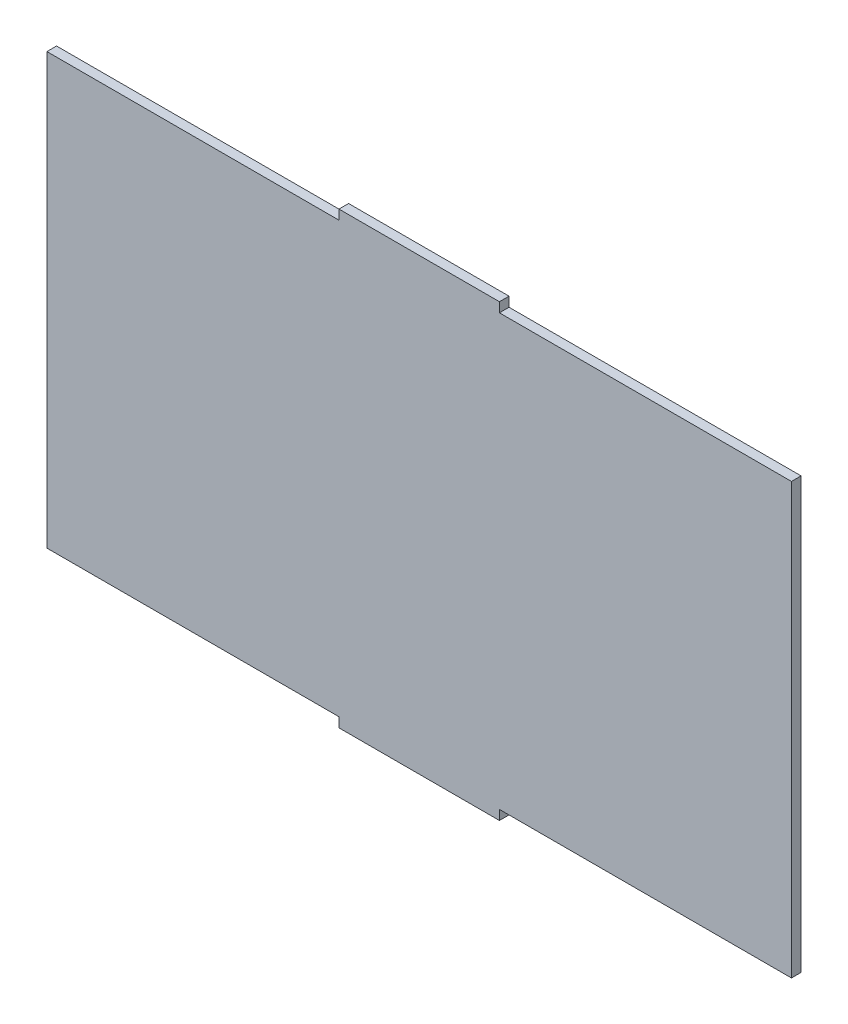
ISO-10303-21;
HEADER;
FILE_DESCRIPTION(('STEP AP214'),'2;1');
FILE_NAME('part.step','',(''),(''),'','','');
FILE_SCHEMA(('AUTOMOTIVE_DESIGN { 1 0 10303 214 1 1 1 1 }'));
ENDSEC;
DATA;
#1=APPLICATION_CONTEXT('core data for automotive mechanical design processes');
#2=APPLICATION_PROTOCOL_DEFINITION('international standard','automotive_design',2000,#1);
#3=PRODUCT_CONTEXT('',#1,'mechanical');
#4=PRODUCT('Part','Part','',(#3));
#5=PRODUCT_RELATED_PRODUCT_CATEGORY('part','',(#4));
#6=PRODUCT_DEFINITION_FORMATION('','',#4);
#7=PRODUCT_DEFINITION_CONTEXT('part definition',#1,'design');
#8=PRODUCT_DEFINITION('design','',#6,#7);
#9=PRODUCT_DEFINITION_SHAPE('','',#8);
#10=(LENGTH_UNIT() NAMED_UNIT(*) SI_UNIT(.MILLI.,.METRE.));
#11=(NAMED_UNIT(*) PLANE_ANGLE_UNIT() SI_UNIT($,.RADIAN.));
#12=(NAMED_UNIT(*) SI_UNIT($,.STERADIAN.) SOLID_ANGLE_UNIT());
#13=UNCERTAINTY_MEASURE_WITH_UNIT(LENGTH_MEASURE(1.E-05),#10,'distance_accuracy_value','');
#14=(GEOMETRIC_REPRESENTATION_CONTEXT(3) GLOBAL_UNCERTAINTY_ASSIGNED_CONTEXT((#13)) GLOBAL_UNIT_ASSIGNED_CONTEXT((#10,
#11,#12)) REPRESENTATION_CONTEXT('',''));
#15=CARTESIAN_POINT('',(0.,0.,0.));
#16=DIRECTION('',(0.,0.,1.));
#17=DIRECTION('',(1.,0.,0.));
#18=AXIS2_PLACEMENT_3D('',#15,#16,#17);
#19=CARTESIAN_POINT('',(0.,134.,3.));
#20=DIRECTION('',(1.,0.,0.));
#21=DIRECTION('',(0.,0.,-1.));
#22=AXIS2_PLACEMENT_3D('',#19,#20,#21);
#23=PLANE('',#22);
#24=DIRECTION('',(0.,-1.,0.));
#25=VECTOR('',#24,1.);
#26=CARTESIAN_POINT('',(0.,134.,0.));
#27=LINE('',#26,#25);
#28=CARTESIAN_POINT('',(0.,134.,0.));
#29=VERTEX_POINT('',#28);
#30=CARTESIAN_POINT('',(0.,0.,0.));
#31=VERTEX_POINT('',#30);
#32=EDGE_CURVE('E153',#29,#31,#27,.T.);
#33=ORIENTED_EDGE('',*,*,#32,.T.);
#34=DIRECTION('',(0.,0.,-1.));
#35=VECTOR('',#34,1.);
#36=CARTESIAN_POINT('',(0.,0.,3.));
#37=LINE('',#36,#35);
#38=CARTESIAN_POINT('',(0.,0.,3.));
#39=VERTEX_POINT('',#38);
#40=EDGE_CURVE('E11',#39,#31,#37,.T.);
#41=ORIENTED_EDGE('',*,*,#40,.F.);
#42=DIRECTION('',(0.,-1.,0.));
#43=VECTOR('',#42,1.);
#44=CARTESIAN_POINT('',(0.,134.,3.));
#45=LINE('',#44,#43);
#46=CARTESIAN_POINT('',(0.,134.,3.));
#47=VERTEX_POINT('',#46);
#48=EDGE_CURVE('E175',#47,#39,#45,.T.);
#49=ORIENTED_EDGE('',*,*,#48,.F.);
#50=DIRECTION('',(0.,0.,-1.));
#51=VECTOR('',#50,1.);
#52=CARTESIAN_POINT('',(0.,134.,3.));
#53=LINE('',#52,#51);
#54=EDGE_CURVE('E149',#47,#29,#53,.T.);
#55=ORIENTED_EDGE('',*,*,#54,.T.);
#56=EDGE_LOOP('',(#33,#41,#49,#55));
#57=FACE_BOUND('',#56,.T.);
#58=ADVANCED_FACE('F33',(#57),#23,.F.);
#59=CARTESIAN_POINT('',(0.,0.,3.));
#60=DIRECTION('',(0.,1.,0.));
#61=DIRECTION('',(0.,0.,1.));
#62=AXIS2_PLACEMENT_3D('',#59,#60,#61);
#63=PLANE('',#62);
#64=DIRECTION('',(1.,0.,0.));
#65=VECTOR('',#64,1.);
#66=CARTESIAN_POINT('',(0.,0.,0.));
#67=LINE('',#66,#65);
#68=CARTESIAN_POINT('',(91.,0.,0.));
#69=VERTEX_POINT('',#68);
#70=EDGE_CURVE('E156',#31,#69,#67,.T.);
#71=ORIENTED_EDGE('',*,*,#70,.T.);
#72=DIRECTION('',(0.,0.,-1.));
#73=VECTOR('',#72,1.);
#74=CARTESIAN_POINT('',(91.,0.,3.));
#75=LINE('',#74,#73);
#76=CARTESIAN_POINT('',(91.,0.,3.));
#77=VERTEX_POINT('',#76);
#78=EDGE_CURVE('E41',#77,#69,#75,.T.);
#79=ORIENTED_EDGE('',*,*,#78,.F.);
#80=DIRECTION('',(1.,0.,0.));
#81=VECTOR('',#80,1.);
#82=CARTESIAN_POINT('',(0.,0.,3.));
#83=LINE('',#82,#81);
#84=EDGE_CURVE('E104',#39,#77,#83,.T.);
#85=ORIENTED_EDGE('',*,*,#84,.F.);
#86=ORIENTED_EDGE('',*,*,#40,.T.);
#87=EDGE_LOOP('',(#71,#79,#85,#86));
#88=FACE_BOUND('',#87,.T.);
#89=ADVANCED_FACE('F253',(#88),#63,.F.);
#90=CARTESIAN_POINT('',(91.,0.,3.));
#91=DIRECTION('',(1.,0.,0.));
#92=DIRECTION('',(0.,0.,-1.));
#93=AXIS2_PLACEMENT_3D('',#90,#91,#92);
#94=PLANE('',#93);
#95=DIRECTION('',(0.,-1.,0.));
#96=VECTOR('',#95,1.);
#97=CARTESIAN_POINT('',(91.,0.,0.));
#98=LINE('',#97,#96);
#99=CARTESIAN_POINT('',(91.,-3.,0.));
#100=VERTEX_POINT('',#99);
#101=EDGE_CURVE('E158',#69,#100,#98,.T.);
#102=ORIENTED_EDGE('',*,*,#101,.T.);
#103=DIRECTION('',(0.,0.,-1.));
#104=VECTOR('',#103,1.);
#105=CARTESIAN_POINT('',(91.,-3.,3.));
#106=LINE('',#105,#104);
#107=CARTESIAN_POINT('',(91.,-3.,3.));
#108=VERTEX_POINT('',#107);
#109=EDGE_CURVE('E194',#108,#100,#106,.T.);
#110=ORIENTED_EDGE('',*,*,#109,.F.);
#111=DIRECTION('',(0.,-1.,0.));
#112=VECTOR('',#111,1.);
#113=CARTESIAN_POINT('',(91.,0.,3.));
#114=LINE('',#113,#112);
#115=EDGE_CURVE('E202',#77,#108,#114,.T.);
#116=ORIENTED_EDGE('',*,*,#115,.F.);
#117=ORIENTED_EDGE('',*,*,#78,.T.);
#118=EDGE_LOOP('',(#102,#110,#116,#117));
#119=FACE_BOUND('',#118,.T.);
#120=ADVANCED_FACE('F200',(#119),#94,.F.);
#121=CARTESIAN_POINT('',(91.,-3.,3.));
#122=DIRECTION('',(0.,1.,0.));
#123=DIRECTION('',(-1.,0.,0.));
#124=AXIS2_PLACEMENT_3D('',#121,#122,#123);
#125=PLANE('',#124);
#126=DIRECTION('',(1.,0.,0.));
#127=VECTOR('',#126,1.);
#128=CARTESIAN_POINT('',(91.,-3.,0.));
#129=LINE('',#128,#127);
#130=CARTESIAN_POINT('',(141.,-3.,0.));
#131=VERTEX_POINT('',#130);
#132=EDGE_CURVE('E160',#100,#131,#129,.T.);
#133=ORIENTED_EDGE('',*,*,#132,.T.);
#134=DIRECTION('',(0.,0.,-1.));
#135=VECTOR('',#134,1.);
#136=CARTESIAN_POINT('',(141.,-3.,3.));
#137=LINE('',#136,#135);
#138=CARTESIAN_POINT('',(141.,-3.,3.));
#139=VERTEX_POINT('',#138);
#140=EDGE_CURVE('E191',#139,#131,#137,.T.);
#141=ORIENTED_EDGE('',*,*,#140,.F.);
#142=DIRECTION('',(1.,0.,0.));
#143=VECTOR('',#142,1.);
#144=CARTESIAN_POINT('',(91.,-3.,3.));
#145=LINE('',#144,#143);
#146=EDGE_CURVE('E220',#108,#139,#145,.T.);
#147=ORIENTED_EDGE('',*,*,#146,.F.);
#148=ORIENTED_EDGE('',*,*,#109,.T.);
#149=EDGE_LOOP('',(#133,#141,#147,#148));
#150=FACE_BOUND('',#149,.T.);
#151=ADVANCED_FACE('F211',(#150),#125,.F.);
#152=CARTESIAN_POINT('',(141.,-3.,3.));
#153=DIRECTION('',(-1.,0.,0.));
#154=DIRECTION('',(0.,0.,1.));
#155=AXIS2_PLACEMENT_3D('',#152,#153,#154);
#156=PLANE('',#155);
#157=DIRECTION('',(0.,1.,0.));
#158=VECTOR('',#157,1.);
#159=CARTESIAN_POINT('',(141.,-3.,0.));
#160=LINE('',#159,#158);
#161=CARTESIAN_POINT('',(141.,0.,0.));
#162=VERTEX_POINT('',#161);
#163=EDGE_CURVE('E162',#131,#162,#160,.T.);
#164=ORIENTED_EDGE('',*,*,#163,.T.);
#165=DIRECTION('',(0.,0.,-1.));
#166=VECTOR('',#165,1.);
#167=CARTESIAN_POINT('',(141.,0.,3.));
#168=LINE('',#167,#166);
#169=CARTESIAN_POINT('',(141.,0.,3.));
#170=VERTEX_POINT('',#169);
#171=EDGE_CURVE('E188',#170,#162,#168,.T.);
#172=ORIENTED_EDGE('',*,*,#171,.F.);
#173=DIRECTION('',(0.,1.,0.));
#174=VECTOR('',#173,1.);
#175=CARTESIAN_POINT('',(141.,-3.,3.));
#176=LINE('',#175,#174);
#177=EDGE_CURVE('E217',#139,#170,#176,.T.);
#178=ORIENTED_EDGE('',*,*,#177,.F.);
#179=ORIENTED_EDGE('',*,*,#140,.T.);
#180=EDGE_LOOP('',(#164,#172,#178,#179));
#181=FACE_BOUND('',#180,.T.);
#182=ADVANCED_FACE('F215',(#181),#156,.F.);
#183=CARTESIAN_POINT('',(141.,0.,3.));
#184=DIRECTION('',(0.,1.,0.));
#185=DIRECTION('',(0.,0.,1.));
#186=AXIS2_PLACEMENT_3D('',#183,#184,#185);
#187=PLANE('',#186);
#188=DIRECTION('',(1.,0.,0.));
#189=VECTOR('',#188,1.);
#190=CARTESIAN_POINT('',(141.,0.,0.));
#191=LINE('',#190,#189);
#192=CARTESIAN_POINT('',(232.,0.,0.));
#193=VERTEX_POINT('',#192);
#194=EDGE_CURVE('E164',#162,#193,#191,.T.);
#195=ORIENTED_EDGE('',*,*,#194,.T.);
#196=DIRECTION('',(0.,0.,-1.));
#197=VECTOR('',#196,1.);
#198=CARTESIAN_POINT('',(232.,0.,3.));
#199=LINE('',#198,#197);
#200=CARTESIAN_POINT('',(232.,0.,3.));
#201=VERTEX_POINT('',#200);
#202=EDGE_CURVE('E185',#201,#193,#199,.T.);
#203=ORIENTED_EDGE('',*,*,#202,.F.);
#204=DIRECTION('',(1.,0.,0.));
#205=VECTOR('',#204,1.);
#206=CARTESIAN_POINT('',(141.,0.,3.));
#207=LINE('',#206,#205);
#208=EDGE_CURVE('E219',#170,#201,#207,.T.);
#209=ORIENTED_EDGE('',*,*,#208,.F.);
#210=ORIENTED_EDGE('',*,*,#171,.T.);
#211=EDGE_LOOP('',(#195,#203,#209,#210));
#212=FACE_BOUND('',#211,.T.);
#213=ADVANCED_FACE('F266',(#212),#187,.F.);
#214=CARTESIAN_POINT('',(232.,0.,3.));
#215=DIRECTION('',(-1.,0.,0.));
#216=DIRECTION('',(0.,0.,1.));
#217=AXIS2_PLACEMENT_3D('',#214,#215,#216);
#218=PLANE('',#217);
#219=DIRECTION('',(0.,1.,0.));
#220=VECTOR('',#219,1.);
#221=CARTESIAN_POINT('',(232.,0.,0.));
#222=LINE('',#221,#220);
#223=CARTESIAN_POINT('',(232.,134.,0.));
#224=VERTEX_POINT('',#223);
#225=EDGE_CURVE('E166',#193,#224,#222,.T.);
#226=ORIENTED_EDGE('',*,*,#225,.T.);
#227=DIRECTION('',(0.,0.,-1.));
#228=VECTOR('',#227,1.);
#229=CARTESIAN_POINT('',(232.,134.,3.));
#230=LINE('',#229,#228);
#231=CARTESIAN_POINT('',(232.,134.,3.));
#232=VERTEX_POINT('',#231);
#233=EDGE_CURVE('E182',#232,#224,#230,.T.);
#234=ORIENTED_EDGE('',*,*,#233,.F.);
#235=DIRECTION('',(0.,1.,0.));
#236=VECTOR('',#235,1.);
#237=CARTESIAN_POINT('',(232.,0.,3.));
#238=LINE('',#237,#236);
#239=EDGE_CURVE('E222',#201,#232,#238,.T.);
#240=ORIENTED_EDGE('',*,*,#239,.F.);
#241=ORIENTED_EDGE('',*,*,#202,.T.);
#242=EDGE_LOOP('',(#226,#234,#240,#241));
#243=FACE_BOUND('',#242,.T.);
#244=ADVANCED_FACE('F269',(#243),#218,.F.);
#245=CARTESIAN_POINT('',(232.,134.,3.));
#246=DIRECTION('',(0.,-1.,0.));
#247=DIRECTION('',(0.,0.,-1.));
#248=AXIS2_PLACEMENT_3D('',#245,#246,#247);
#249=PLANE('',#248);
#250=DIRECTION('',(-1.,0.,0.));
#251=VECTOR('',#250,1.);
#252=CARTESIAN_POINT('',(232.,134.,0.));
#253=LINE('',#252,#251);
#254=CARTESIAN_POINT('',(141.,134.,0.));
#255=VERTEX_POINT('',#254);
#256=EDGE_CURVE('E168',#224,#255,#253,.T.);
#257=ORIENTED_EDGE('',*,*,#256,.T.);
#258=DIRECTION('',(0.,0.,-1.));
#259=VECTOR('',#258,1.);
#260=CARTESIAN_POINT('',(141.,134.,3.));
#261=LINE('',#260,#259);
#262=CARTESIAN_POINT('',(141.,134.,3.));
#263=VERTEX_POINT('',#262);
#264=EDGE_CURVE('E179',#263,#255,#261,.T.);
#265=ORIENTED_EDGE('',*,*,#264,.F.);
#266=DIRECTION('',(-1.,0.,0.));
#267=VECTOR('',#266,1.);
#268=CARTESIAN_POINT('',(232.,134.,3.));
#269=LINE('',#268,#267);
#270=EDGE_CURVE('E228',#232,#263,#269,.T.);
#271=ORIENTED_EDGE('',*,*,#270,.F.);
#272=ORIENTED_EDGE('',*,*,#233,.T.);
#273=EDGE_LOOP('',(#257,#265,#271,#272));
#274=FACE_BOUND('',#273,.T.);
#275=ADVANCED_FACE('F234',(#274),#249,.F.);
#276=CARTESIAN_POINT('',(141.,134.,3.));
#277=DIRECTION('',(-1.,0.,0.));
#278=DIRECTION('',(0.,0.,1.));
#279=AXIS2_PLACEMENT_3D('',#276,#277,#278);
#280=PLANE('',#279);
#281=DIRECTION('',(0.,1.,0.));
#282=VECTOR('',#281,1.);
#283=CARTESIAN_POINT('',(141.,134.,0.));
#284=LINE('',#283,#282);
#285=CARTESIAN_POINT('',(141.,137.,0.));
#286=VERTEX_POINT('',#285);
#287=EDGE_CURVE('E170',#255,#286,#284,.T.);
#288=ORIENTED_EDGE('',*,*,#287,.T.);
#289=DIRECTION('',(0.,0.,-1.));
#290=VECTOR('',#289,1.);
#291=CARTESIAN_POINT('',(141.,137.,3.));
#292=LINE('',#291,#290);
#293=CARTESIAN_POINT('',(141.,137.,3.));
#294=VERTEX_POINT('',#293);
#295=EDGE_CURVE('E144',#294,#286,#292,.T.);
#296=ORIENTED_EDGE('',*,*,#295,.F.);
#297=DIRECTION('',(0.,1.,0.));
#298=VECTOR('',#297,1.);
#299=CARTESIAN_POINT('',(141.,134.,3.));
#300=LINE('',#299,#298);
#301=EDGE_CURVE('E135',#263,#294,#300,.T.);
#302=ORIENTED_EDGE('',*,*,#301,.F.);
#303=ORIENTED_EDGE('',*,*,#264,.T.);
#304=EDGE_LOOP('',(#288,#296,#302,#303));
#305=FACE_BOUND('',#304,.T.);
#306=ADVANCED_FACE('F238',(#305),#280,.F.);
#307=CARTESIAN_POINT('',(141.,137.,3.));
#308=DIRECTION('',(0.,-1.,0.));
#309=DIRECTION('',(0.,0.,-1.));
#310=AXIS2_PLACEMENT_3D('',#307,#308,#309);
#311=PLANE('',#310);
#312=DIRECTION('',(-1.,0.,0.));
#313=VECTOR('',#312,1.);
#314=CARTESIAN_POINT('',(141.,137.,0.));
#315=LINE('',#314,#313);
#316=CARTESIAN_POINT('',(91.,137.,0.));
#317=VERTEX_POINT('',#316);
#318=EDGE_CURVE('E143',#286,#317,#315,.T.);
#319=ORIENTED_EDGE('',*,*,#318,.T.);
#320=DIRECTION('',(0.,0.,-1.));
#321=VECTOR('',#320,1.);
#322=CARTESIAN_POINT('',(91.,137.,3.));
#323=LINE('',#322,#321);
#324=CARTESIAN_POINT('',(91.,137.,3.));
#325=VERTEX_POINT('',#324);
#326=EDGE_CURVE('E140',#325,#317,#323,.T.);
#327=ORIENTED_EDGE('',*,*,#326,.F.);
#328=DIRECTION('',(-1.,0.,0.));
#329=VECTOR('',#328,1.);
#330=CARTESIAN_POINT('',(141.,137.,3.));
#331=LINE('',#330,#329);
#332=EDGE_CURVE('E129',#294,#325,#331,.T.);
#333=ORIENTED_EDGE('',*,*,#332,.F.);
#334=ORIENTED_EDGE('',*,*,#295,.T.);
#335=EDGE_LOOP('',(#319,#327,#333,#334));
#336=FACE_BOUND('',#335,.T.);
#337=ADVANCED_FACE('F141',(#336),#311,.F.);
#338=CARTESIAN_POINT('',(91.,137.,3.));
#339=DIRECTION('',(1.,0.,0.));
#340=DIRECTION('',(0.,0.,-1.));
#341=AXIS2_PLACEMENT_3D('',#338,#339,#340);
#342=PLANE('',#341);
#343=DIRECTION('',(0.,-1.,0.));
#344=VECTOR('',#343,1.);
#345=CARTESIAN_POINT('',(91.,137.,0.));
#346=LINE('',#345,#344);
#347=CARTESIAN_POINT('',(91.,134.,0.));
#348=VERTEX_POINT('',#347);
#349=EDGE_CURVE('E90',#317,#348,#346,.T.);
#350=ORIENTED_EDGE('',*,*,#349,.T.);
#351=DIRECTION('',(0.,0.,-1.));
#352=VECTOR('',#351,1.);
#353=CARTESIAN_POINT('',(91.,134.,3.));
#354=LINE('',#353,#352);
#355=CARTESIAN_POINT('',(91.,134.,3.));
#356=VERTEX_POINT('',#355);
#357=EDGE_CURVE('E145',#356,#348,#354,.T.);
#358=ORIENTED_EDGE('',*,*,#357,.F.);
#359=DIRECTION('',(0.,-1.,0.));
#360=VECTOR('',#359,1.);
#361=CARTESIAN_POINT('',(91.,137.,3.));
#362=LINE('',#361,#360);
#363=EDGE_CURVE('E133',#325,#356,#362,.T.);
#364=ORIENTED_EDGE('',*,*,#363,.F.);
#365=ORIENTED_EDGE('',*,*,#326,.T.);
#366=EDGE_LOOP('',(#350,#358,#364,#365));
#367=FACE_BOUND('',#366,.T.);
#368=ADVANCED_FACE('F147',(#367),#342,.F.);
#369=CARTESIAN_POINT('',(91.,134.,3.));
#370=DIRECTION('',(0.,-1.,0.));
#371=DIRECTION('',(0.,0.,-1.));
#372=AXIS2_PLACEMENT_3D('',#369,#370,#371);
#373=PLANE('',#372);
#374=DIRECTION('',(-1.,0.,0.));
#375=VECTOR('',#374,1.);
#376=CARTESIAN_POINT('',(91.,134.,0.));
#377=LINE('',#376,#375);
#378=EDGE_CURVE('E96',#348,#29,#377,.T.);
#379=ORIENTED_EDGE('',*,*,#378,.T.);
#380=ORIENTED_EDGE('',*,*,#54,.F.);
#381=DIRECTION('',(-1.,0.,0.));
#382=VECTOR('',#381,1.);
#383=CARTESIAN_POINT('',(91.,134.,3.));
#384=LINE('',#383,#382);
#385=EDGE_CURVE('E49',#356,#47,#384,.T.);
#386=ORIENTED_EDGE('',*,*,#385,.F.);
#387=ORIENTED_EDGE('',*,*,#357,.T.);
#388=EDGE_LOOP('',(#379,#380,#386,#387));
#389=FACE_BOUND('',#388,.T.);
#390=ADVANCED_FACE('F242',(#389),#373,.F.);
#391=CARTESIAN_POINT('',(0.,0.,3.));
#392=DIRECTION('',(0.,0.,1.));
#393=DIRECTION('',(1.,0.,0.));
#394=AXIS2_PLACEMENT_3D('',#391,#392,#393);
#395=PLANE('',#394);
#396=ORIENTED_EDGE('',*,*,#48,.T.);
#397=ORIENTED_EDGE('',*,*,#84,.T.);
#398=ORIENTED_EDGE('',*,*,#115,.T.);
#399=ORIENTED_EDGE('',*,*,#146,.T.);
#400=ORIENTED_EDGE('',*,*,#177,.T.);
#401=ORIENTED_EDGE('',*,*,#208,.T.);
#402=ORIENTED_EDGE('',*,*,#239,.T.);
#403=ORIENTED_EDGE('',*,*,#270,.T.);
#404=ORIENTED_EDGE('',*,*,#301,.T.);
#405=ORIENTED_EDGE('',*,*,#332,.T.);
#406=ORIENTED_EDGE('',*,*,#363,.T.);
#407=ORIENTED_EDGE('',*,*,#385,.T.);
#408=EDGE_LOOP('',(#396,#397,#398,#399,#400,#401,#402,#403,#404,#405,#406,#407));
#409=FACE_BOUND('',#408,.T.);
#410=ADVANCED_FACE('F131',(#409),#395,.T.);
#411=CARTESIAN_POINT('',(0.,0.,0.));
#412=DIRECTION('',(0.,0.,1.));
#413=DIRECTION('',(1.,0.,0.));
#414=AXIS2_PLACEMENT_3D('',#411,#412,#413);
#415=PLANE('',#414);
#416=ORIENTED_EDGE('',*,*,#32,.F.);
#417=ORIENTED_EDGE('',*,*,#378,.F.);
#418=ORIENTED_EDGE('',*,*,#349,.F.);
#419=ORIENTED_EDGE('',*,*,#318,.F.);
#420=ORIENTED_EDGE('',*,*,#287,.F.);
#421=ORIENTED_EDGE('',*,*,#256,.F.);
#422=ORIENTED_EDGE('',*,*,#225,.F.);
#423=ORIENTED_EDGE('',*,*,#194,.F.);
#424=ORIENTED_EDGE('',*,*,#163,.F.);
#425=ORIENTED_EDGE('',*,*,#132,.F.);
#426=ORIENTED_EDGE('',*,*,#101,.F.);
#427=ORIENTED_EDGE('',*,*,#70,.F.);
#428=EDGE_LOOP('',(#416,#417,#418,#419,#420,#421,#422,#423,#424,#425,#426,#427));
#429=FACE_BOUND('',#428,.T.);
#430=ADVANCED_FACE('F206',(#429),#415,.F.);
#431=CLOSED_SHELL('',(#58,#89,#120,#151,#182,#213,#244,#275,#306,#337,#368,#390,#410,#430));
#432=MANIFOLD_SOLID_BREP('B2',#431);
#433=ADVANCED_BREP_SHAPE_REPRESENTATION('',(#18,#432),#14);
#434=SHAPE_DEFINITION_REPRESENTATION(#9,#433);
ENDSEC;
END-ISO-10303-21;
